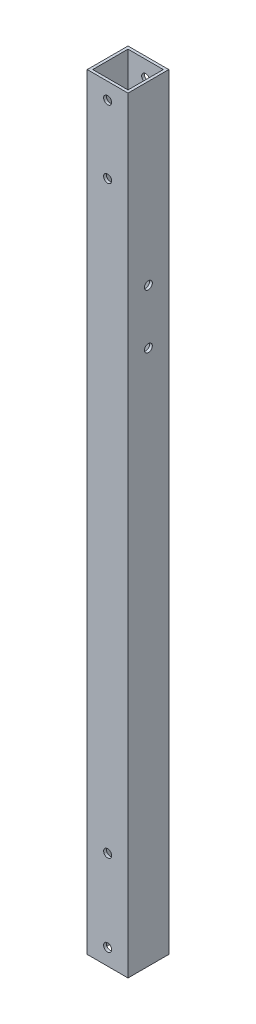
ISO-10303-21;
HEADER;
FILE_DESCRIPTION(('STEP AP214'),'2;1');
FILE_NAME('part.step','',(''),(''),'','','');
FILE_SCHEMA(('AUTOMOTIVE_DESIGN { 1 0 10303 214 1 1 1 1 }'));
ENDSEC;
DATA;
#1=APPLICATION_CONTEXT('core data for automotive mechanical design processes');
#2=APPLICATION_PROTOCOL_DEFINITION('international standard','automotive_design',2000,#1);
#3=PRODUCT_CONTEXT('',#1,'mechanical');
#4=PRODUCT('Part','Part','',(#3));
#5=PRODUCT_RELATED_PRODUCT_CATEGORY('part','',(#4));
#6=PRODUCT_DEFINITION_FORMATION('','',#4);
#7=PRODUCT_DEFINITION_CONTEXT('part definition',#1,'design');
#8=PRODUCT_DEFINITION('design','',#6,#7);
#9=PRODUCT_DEFINITION_SHAPE('','',#8);
#10=(LENGTH_UNIT() NAMED_UNIT(*) SI_UNIT(.MILLI.,.METRE.));
#11=(NAMED_UNIT(*) PLANE_ANGLE_UNIT() SI_UNIT($,.RADIAN.));
#12=(NAMED_UNIT(*) SI_UNIT($,.STERADIAN.) SOLID_ANGLE_UNIT());
#13=UNCERTAINTY_MEASURE_WITH_UNIT(LENGTH_MEASURE(1.E-05),#10,'distance_accuracy_value','');
#14=(GEOMETRIC_REPRESENTATION_CONTEXT(3) GLOBAL_UNCERTAINTY_ASSIGNED_CONTEXT((#13)) GLOBAL_UNIT_ASSIGNED_CONTEXT((#10,
#11,#12)) REPRESENTATION_CONTEXT('',''));
#15=CARTESIAN_POINT('',(0.,0.,0.));
#16=DIRECTION('',(0.,0.,1.));
#17=DIRECTION('',(1.,0.,0.));
#18=AXIS2_PLACEMENT_3D('',#15,#16,#17);
#19=CARTESIAN_POINT('',(0.,282.,0.));
#20=DIRECTION('',(0.,1.,0.));
#21=DIRECTION('',(0.,0.,1.));
#22=AXIS2_PLACEMENT_3D('',#19,#20,#21);
#23=PLANE('',#22);
#24=DIRECTION('',(0.,0.,-1.));
#25=VECTOR('',#24,1.);
#26=CARTESIAN_POINT('',(7.5,282.,7.5));
#27=LINE('',#26,#25);
#28=CARTESIAN_POINT('',(7.5,282.,7.5));
#29=VERTEX_POINT('',#28);
#30=CARTESIAN_POINT('',(7.5,282.,-7.5));
#31=VERTEX_POINT('',#30);
#32=EDGE_CURVE('E191',#29,#31,#27,.T.);
#33=ORIENTED_EDGE('',*,*,#32,.T.);
#34=DIRECTION('',(-1.,0.,0.));
#35=VECTOR('',#34,1.);
#36=CARTESIAN_POINT('',(-7.5,282.,-7.5));
#37=LINE('',#36,#35);
#38=CARTESIAN_POINT('',(-7.5,282.,-7.5));
#39=VERTEX_POINT('',#38);
#40=EDGE_CURVE('E195',#31,#39,#37,.T.);
#41=ORIENTED_EDGE('',*,*,#40,.T.);
#42=DIRECTION('',(0.,0.,1.));
#43=VECTOR('',#42,1.);
#44=CARTESIAN_POINT('',(-7.5,282.,7.5));
#45=LINE('',#44,#43);
#46=CARTESIAN_POINT('',(-7.5,282.,7.5));
#47=VERTEX_POINT('',#46);
#48=EDGE_CURVE('E199',#39,#47,#45,.T.);
#49=ORIENTED_EDGE('',*,*,#48,.T.);
#50=DIRECTION('',(1.,0.,0.));
#51=VECTOR('',#50,1.);
#52=CARTESIAN_POINT('',(-7.5,282.,7.5));
#53=LINE('',#52,#51);
#54=EDGE_CURVE('E202',#47,#29,#53,.T.);
#55=ORIENTED_EDGE('',*,*,#54,.T.);
#56=EDGE_LOOP('',(#33,#41,#49,#55));
#57=FACE_BOUND('',#56,.T.);
#58=DIRECTION('',(-1.,0.,0.));
#59=VECTOR('',#58,1.);
#60=CARTESIAN_POINT('',(0.,282.,-6.5));
#61=LINE('',#60,#59);
#62=CARTESIAN_POINT('',(6.5,282.,-6.5));
#63=VERTEX_POINT('',#62);
#64=CARTESIAN_POINT('',(-6.5,282.,-6.5));
#65=VERTEX_POINT('',#64);
#66=EDGE_CURVE('E149',#63,#65,#61,.T.);
#67=ORIENTED_EDGE('',*,*,#66,.F.);
#68=DIRECTION('',(0.,0.,-1.));
#69=VECTOR('',#68,1.);
#70=CARTESIAN_POINT('',(6.5,282.,0.));
#71=LINE('',#70,#69);
#72=CARTESIAN_POINT('',(6.5,282.,6.5));
#73=VERTEX_POINT('',#72);
#74=EDGE_CURVE('E140',#73,#63,#71,.T.);
#75=ORIENTED_EDGE('',*,*,#74,.F.);
#76=DIRECTION('',(1.,0.,0.));
#77=VECTOR('',#76,1.);
#78=CARTESIAN_POINT('',(0.,282.,6.5));
#79=LINE('',#78,#77);
#80=CARTESIAN_POINT('',(-6.5,282.,6.5));
#81=VERTEX_POINT('',#80);
#82=EDGE_CURVE('E169',#81,#73,#79,.T.);
#83=ORIENTED_EDGE('',*,*,#82,.F.);
#84=DIRECTION('',(0.,0.,1.));
#85=VECTOR('',#84,1.);
#86=CARTESIAN_POINT('',(-6.5,282.,0.));
#87=LINE('',#86,#85);
#88=EDGE_CURVE('E162',#65,#81,#87,.T.);
#89=ORIENTED_EDGE('',*,*,#88,.F.);
#90=EDGE_LOOP('',(#67,#75,#83,#89));
#91=FACE_BOUND('',#90,.T.);
#92=ADVANCED_FACE('F72',(#57,#91),#23,.T.);
#93=CARTESIAN_POINT('',(0.,0.,0.));
#94=DIRECTION('',(0.,1.,0.));
#95=DIRECTION('',(0.,0.,1.));
#96=AXIS2_PLACEMENT_3D('',#93,#94,#95);
#97=PLANE('',#96);
#98=DIRECTION('',(0.,0.,-1.));
#99=VECTOR('',#98,1.);
#100=CARTESIAN_POINT('',(7.5,0.,7.5));
#101=LINE('',#100,#99);
#102=CARTESIAN_POINT('',(7.5,0.,7.5));
#103=VERTEX_POINT('',#102);
#104=CARTESIAN_POINT('',(7.5,0.,-7.5));
#105=VERTEX_POINT('',#104);
#106=EDGE_CURVE('E158',#103,#105,#101,.T.);
#107=ORIENTED_EDGE('',*,*,#106,.F.);
#108=DIRECTION('',(1.,0.,0.));
#109=VECTOR('',#108,1.);
#110=CARTESIAN_POINT('',(-7.5,0.,7.5));
#111=LINE('',#110,#109);
#112=CARTESIAN_POINT('',(-7.5,0.,7.5));
#113=VERTEX_POINT('',#112);
#114=EDGE_CURVE('E196',#113,#103,#111,.T.);
#115=ORIENTED_EDGE('',*,*,#114,.F.);
#116=DIRECTION('',(0.,0.,1.));
#117=VECTOR('',#116,1.);
#118=CARTESIAN_POINT('',(-7.5,0.,7.5));
#119=LINE('',#118,#117);
#120=CARTESIAN_POINT('',(-7.5,0.,-7.5));
#121=VERTEX_POINT('',#120);
#122=EDGE_CURVE('E212',#121,#113,#119,.T.);
#123=ORIENTED_EDGE('',*,*,#122,.F.);
#124=DIRECTION('',(-1.,0.,0.));
#125=VECTOR('',#124,1.);
#126=CARTESIAN_POINT('',(-7.5,0.,-7.5));
#127=LINE('',#126,#125);
#128=EDGE_CURVE('E209',#105,#121,#127,.T.);
#129=ORIENTED_EDGE('',*,*,#128,.F.);
#130=EDGE_LOOP('',(#107,#115,#123,#129));
#131=FACE_BOUND('',#130,.T.);
#132=DIRECTION('',(0.,0.,-1.));
#133=VECTOR('',#132,1.);
#134=CARTESIAN_POINT('',(6.5,0.,0.));
#135=LINE('',#134,#133);
#136=CARTESIAN_POINT('',(6.5,0.,6.5));
#137=VERTEX_POINT('',#136);
#138=CARTESIAN_POINT('',(6.5,0.,-6.5));
#139=VERTEX_POINT('',#138);
#140=EDGE_CURVE('E98',#137,#139,#135,.T.);
#141=ORIENTED_EDGE('',*,*,#140,.T.);
#142=DIRECTION('',(-1.,0.,0.));
#143=VECTOR('',#142,1.);
#144=CARTESIAN_POINT('',(0.,0.,-6.5));
#145=LINE('',#144,#143);
#146=CARTESIAN_POINT('',(-6.5,0.,-6.5));
#147=VERTEX_POINT('',#146);
#148=EDGE_CURVE('E156',#139,#147,#145,.T.);
#149=ORIENTED_EDGE('',*,*,#148,.T.);
#150=DIRECTION('',(0.,0.,1.));
#151=VECTOR('',#150,1.);
#152=CARTESIAN_POINT('',(-6.5,0.,0.));
#153=LINE('',#152,#151);
#154=CARTESIAN_POINT('',(-6.5,0.,6.5));
#155=VERTEX_POINT('',#154);
#156=EDGE_CURVE('E178',#147,#155,#153,.T.);
#157=ORIENTED_EDGE('',*,*,#156,.T.);
#158=DIRECTION('',(1.,0.,0.));
#159=VECTOR('',#158,1.);
#160=CARTESIAN_POINT('',(0.,0.,6.5));
#161=LINE('',#160,#159);
#162=EDGE_CURVE('E150',#155,#137,#161,.T.);
#163=ORIENTED_EDGE('',*,*,#162,.T.);
#164=EDGE_LOOP('',(#141,#149,#157,#163));
#165=FACE_BOUND('',#164,.T.);
#166=ADVANCED_FACE('F360',(#131,#165),#97,.F.);
#167=CARTESIAN_POINT('',(7.5,282.,7.5));
#168=DIRECTION('',(-1.,0.,0.));
#169=DIRECTION('',(0.,0.,1.));
#170=AXIS2_PLACEMENT_3D('',#167,#168,#169);
#171=PLANE('',#170);
#172=CARTESIAN_POINT('',(7.5,217.,0.));
#173=DIRECTION('',(1.,0.,0.));
#174=DIRECTION('',(0.,0.,-1.));
#175=AXIS2_PLACEMENT_3D('',#172,#173,#174);
#176=CIRCLE('',#175,1.45);
#177=CARTESIAN_POINT('',(7.5,217.,-1.45));
#178=VERTEX_POINT('',#177);
#179=EDGE_CURVE('E259',#178,#178,#176,.T.);
#180=ORIENTED_EDGE('',*,*,#179,.F.);
#181=EDGE_LOOP('',(#180));
#182=FACE_BOUND('',#181,.T.);
#183=CARTESIAN_POINT('',(7.5,197.,0.));
#184=DIRECTION('',(1.,0.,0.));
#185=DIRECTION('',(0.,0.,-1.));
#186=AXIS2_PLACEMENT_3D('',#183,#184,#185);
#187=CIRCLE('',#186,1.45000000000001);
#188=CARTESIAN_POINT('',(7.5,197.,-1.45000000000001));
#189=VERTEX_POINT('',#188);
#190=EDGE_CURVE('E267',#189,#189,#187,.T.);
#191=ORIENTED_EDGE('',*,*,#190,.F.);
#192=EDGE_LOOP('',(#191));
#193=FACE_BOUND('',#192,.T.);
#194=ORIENTED_EDGE('',*,*,#106,.T.);
#195=DIRECTION('',(0.,-1.,0.));
#196=VECTOR('',#195,1.);
#197=CARTESIAN_POINT('',(7.5,282.,-7.5));
#198=LINE('',#197,#196);
#199=EDGE_CURVE('E12',#31,#105,#198,.T.);
#200=ORIENTED_EDGE('',*,*,#199,.F.);
#201=ORIENTED_EDGE('',*,*,#32,.F.);
#202=DIRECTION('',(0.,-1.,0.));
#203=VECTOR('',#202,1.);
#204=CARTESIAN_POINT('',(7.5,282.,7.5));
#205=LINE('',#204,#203);
#206=EDGE_CURVE('E205',#29,#103,#205,.T.);
#207=ORIENTED_EDGE('',*,*,#206,.T.);
#208=EDGE_LOOP('',(#194,#200,#201,#207));
#209=FACE_BOUND('',#208,.T.);
#210=ADVANCED_FACE('F74',(#182,#193,#209),#171,.F.);
#211=CARTESIAN_POINT('',(-7.5,282.,-7.5));
#212=DIRECTION('',(0.,0.,1.));
#213=DIRECTION('',(1.,0.,0.));
#214=AXIS2_PLACEMENT_3D('',#211,#212,#213);
#215=PLANE('',#214);
#216=CARTESIAN_POINT('',(0.,6.,-7.5));
#217=DIRECTION('',(0.,0.,1.));
#218=DIRECTION('',(1.,0.,0.));
#219=AXIS2_PLACEMENT_3D('',#216,#217,#218);
#220=CIRCLE('',#219,1.475);
#221=CARTESIAN_POINT('',(1.475,6.,-7.5));
#222=VERTEX_POINT('',#221);
#223=EDGE_CURVE('E294',#222,#222,#220,.T.);
#224=ORIENTED_EDGE('',*,*,#223,.T.);
#225=EDGE_LOOP('',(#224));
#226=FACE_BOUND('',#225,.T.);
#227=CARTESIAN_POINT('',(0.,276.,-7.5));
#228=DIRECTION('',(0.,0.,1.));
#229=DIRECTION('',(1.,0.,0.));
#230=AXIS2_PLACEMENT_3D('',#227,#228,#229);
#231=CIRCLE('',#230,1.47500000000002);
#232=CARTESIAN_POINT('',(1.47500000000002,276.,-7.5));
#233=VERTEX_POINT('',#232);
#234=EDGE_CURVE('E285',#233,#233,#231,.T.);
#235=ORIENTED_EDGE('',*,*,#234,.T.);
#236=EDGE_LOOP('',(#235));
#237=FACE_BOUND('',#236,.T.);
#238=CARTESIAN_POINT('',(0.,251.,-7.5));
#239=DIRECTION('',(0.,0.,1.));
#240=DIRECTION('',(1.,0.,0.));
#241=AXIS2_PLACEMENT_3D('',#238,#239,#240);
#242=CIRCLE('',#241,1.47500000000001);
#243=CARTESIAN_POINT('',(1.47500000000001,251.,-7.5));
#244=VERTEX_POINT('',#243);
#245=EDGE_CURVE('E280',#244,#244,#242,.T.);
#246=ORIENTED_EDGE('',*,*,#245,.T.);
#247=EDGE_LOOP('',(#246));
#248=FACE_BOUND('',#247,.T.);
#249=CARTESIAN_POINT('',(0.,36.,-7.5));
#250=DIRECTION('',(0.,0.,1.));
#251=DIRECTION('',(1.,0.,0.));
#252=AXIS2_PLACEMENT_3D('',#249,#250,#251);
#253=CIRCLE('',#252,1.475);
#254=CARTESIAN_POINT('',(1.475,36.,-7.5));
#255=VERTEX_POINT('',#254);
#256=EDGE_CURVE('E232',#255,#255,#253,.T.);
#257=ORIENTED_EDGE('',*,*,#256,.T.);
#258=EDGE_LOOP('',(#257));
#259=FACE_BOUND('',#258,.T.);
#260=ORIENTED_EDGE('',*,*,#128,.T.);
#261=DIRECTION('',(0.,-1.,0.));
#262=VECTOR('',#261,1.);
#263=CARTESIAN_POINT('',(-7.5,282.,-7.5));
#264=LINE('',#263,#262);
#265=EDGE_CURVE('E82',#39,#121,#264,.T.);
#266=ORIENTED_EDGE('',*,*,#265,.F.);
#267=ORIENTED_EDGE('',*,*,#40,.F.);
#268=ORIENTED_EDGE('',*,*,#199,.T.);
#269=EDGE_LOOP('',(#260,#266,#267,#268));
#270=FACE_BOUND('',#269,.T.);
#271=ADVANCED_FACE('F346',(#226,#237,#248,#259,#270),#215,.F.);
#272=CARTESIAN_POINT('',(-7.5,282.,7.5));
#273=DIRECTION('',(1.,0.,0.));
#274=DIRECTION('',(0.,0.,-1.));
#275=AXIS2_PLACEMENT_3D('',#272,#273,#274);
#276=PLANE('',#275);
#277=CARTESIAN_POINT('',(-7.5,217.,0.));
#278=DIRECTION('',(1.,0.,0.));
#279=DIRECTION('',(0.,0.,-1.));
#280=AXIS2_PLACEMENT_3D('',#277,#278,#279);
#281=CIRCLE('',#280,1.45);
#282=CARTESIAN_POINT('',(-7.5,217.,-1.45));
#283=VERTEX_POINT('',#282);
#284=EDGE_CURVE('E250',#283,#283,#281,.T.);
#285=ORIENTED_EDGE('',*,*,#284,.T.);
#286=EDGE_LOOP('',(#285));
#287=FACE_BOUND('',#286,.T.);
#288=CARTESIAN_POINT('',(-7.5,197.,0.));
#289=DIRECTION('',(1.,0.,0.));
#290=DIRECTION('',(0.,0.,-1.));
#291=AXIS2_PLACEMENT_3D('',#288,#289,#290);
#292=CIRCLE('',#291,1.45000000000001);
#293=CARTESIAN_POINT('',(-7.5,197.,-1.45000000000001));
#294=VERTEX_POINT('',#293);
#295=EDGE_CURVE('E273',#294,#294,#292,.T.);
#296=ORIENTED_EDGE('',*,*,#295,.T.);
#297=EDGE_LOOP('',(#296));
#298=FACE_BOUND('',#297,.T.);
#299=ORIENTED_EDGE('',*,*,#122,.T.);
#300=DIRECTION('',(0.,-1.,0.));
#301=VECTOR('',#300,1.);
#302=CARTESIAN_POINT('',(-7.5,282.,7.5));
#303=LINE('',#302,#301);
#304=EDGE_CURVE('E220',#47,#113,#303,.T.);
#305=ORIENTED_EDGE('',*,*,#304,.F.);
#306=ORIENTED_EDGE('',*,*,#48,.F.);
#307=ORIENTED_EDGE('',*,*,#265,.T.);
#308=EDGE_LOOP('',(#299,#305,#306,#307));
#309=FACE_BOUND('',#308,.T.);
#310=ADVANCED_FACE('F349',(#287,#298,#309),#276,.F.);
#311=CARTESIAN_POINT('',(-7.5,282.,7.5));
#312=DIRECTION('',(0.,0.,-1.));
#313=DIRECTION('',(-1.,0.,0.));
#314=AXIS2_PLACEMENT_3D('',#311,#312,#313);
#315=PLANE('',#314);
#316=CARTESIAN_POINT('',(0.,6.,7.5));
#317=DIRECTION('',(0.,0.,1.));
#318=DIRECTION('',(1.,0.,0.));
#319=AXIS2_PLACEMENT_3D('',#316,#317,#318);
#320=CIRCLE('',#319,1.475);
#321=CARTESIAN_POINT('',(1.475,6.,7.5));
#322=VERTEX_POINT('',#321);
#323=EDGE_CURVE('E289',#322,#322,#320,.T.);
#324=ORIENTED_EDGE('',*,*,#323,.F.);
#325=EDGE_LOOP('',(#324));
#326=FACE_BOUND('',#325,.T.);
#327=CARTESIAN_POINT('',(0.,276.,7.5));
#328=DIRECTION('',(0.,0.,1.));
#329=DIRECTION('',(1.,0.,0.));
#330=AXIS2_PLACEMENT_3D('',#327,#328,#329);
#331=CIRCLE('',#330,1.47500000000002);
#332=CARTESIAN_POINT('',(1.47500000000002,276.,7.5));
#333=VERTEX_POINT('',#332);
#334=EDGE_CURVE('E298',#333,#333,#331,.T.);
#335=ORIENTED_EDGE('',*,*,#334,.F.);
#336=EDGE_LOOP('',(#335));
#337=FACE_BOUND('',#336,.T.);
#338=CARTESIAN_POINT('',(0.,251.,7.5));
#339=DIRECTION('',(0.,0.,1.));
#340=DIRECTION('',(1.,0.,0.));
#341=AXIS2_PLACEMENT_3D('',#338,#339,#340);
#342=CIRCLE('',#341,1.47500000000001);
#343=CARTESIAN_POINT('',(1.47500000000001,251.,7.5));
#344=VERTEX_POINT('',#343);
#345=EDGE_CURVE('E281',#344,#344,#342,.T.);
#346=ORIENTED_EDGE('',*,*,#345,.F.);
#347=EDGE_LOOP('',(#346));
#348=FACE_BOUND('',#347,.T.);
#349=CARTESIAN_POINT('',(0.,36.,7.5));
#350=DIRECTION('',(0.,0.,1.));
#351=DIRECTION('',(1.,0.,0.));
#352=AXIS2_PLACEMENT_3D('',#349,#350,#351);
#353=CIRCLE('',#352,1.475);
#354=CARTESIAN_POINT('',(1.475,36.,7.5));
#355=VERTEX_POINT('',#354);
#356=EDGE_CURVE('E293',#355,#355,#353,.T.);
#357=ORIENTED_EDGE('',*,*,#356,.F.);
#358=EDGE_LOOP('',(#357));
#359=FACE_BOUND('',#358,.T.);
#360=ORIENTED_EDGE('',*,*,#114,.T.);
#361=ORIENTED_EDGE('',*,*,#206,.F.);
#362=ORIENTED_EDGE('',*,*,#54,.F.);
#363=ORIENTED_EDGE('',*,*,#304,.T.);
#364=EDGE_LOOP('',(#360,#361,#362,#363));
#365=FACE_BOUND('',#364,.T.);
#366=ADVANCED_FACE('F364',(#326,#337,#348,#359,#365),#315,.F.);
#367=CARTESIAN_POINT('',(6.5,282.,0.));
#368=DIRECTION('',(-1.,0.,0.));
#369=DIRECTION('',(0.,0.,1.));
#370=AXIS2_PLACEMENT_3D('',#367,#368,#369);
#371=PLANE('',#370);
#372=CARTESIAN_POINT('',(6.5,217.,0.));
#373=DIRECTION('',(-1.,0.,0.));
#374=DIRECTION('',(0.,0.,1.));
#375=AXIS2_PLACEMENT_3D('',#372,#373,#374);
#376=CIRCLE('',#375,1.45);
#377=CARTESIAN_POINT('',(6.5,217.,1.45));
#378=VERTEX_POINT('',#377);
#379=EDGE_CURVE('E277',#378,#378,#376,.T.);
#380=ORIENTED_EDGE('',*,*,#379,.F.);
#381=EDGE_LOOP('',(#380));
#382=FACE_BOUND('',#381,.T.);
#383=CARTESIAN_POINT('',(6.5,197.,0.));
#384=DIRECTION('',(-1.,0.,0.));
#385=DIRECTION('',(0.,0.,1.));
#386=AXIS2_PLACEMENT_3D('',#383,#384,#385);
#387=CIRCLE('',#386,1.45000000000001);
#388=CARTESIAN_POINT('',(6.5,197.,1.45000000000001));
#389=VERTEX_POINT('',#388);
#390=EDGE_CURVE('E249',#389,#389,#387,.T.);
#391=ORIENTED_EDGE('',*,*,#390,.F.);
#392=EDGE_LOOP('',(#391));
#393=FACE_BOUND('',#392,.T.);
#394=ORIENTED_EDGE('',*,*,#140,.F.);
#395=DIRECTION('',(0.,-1.,0.));
#396=VECTOR('',#395,1.);
#397=CARTESIAN_POINT('',(6.5,282.,6.5));
#398=LINE('',#397,#396);
#399=EDGE_CURVE('E144',#73,#137,#398,.T.);
#400=ORIENTED_EDGE('',*,*,#399,.F.);
#401=ORIENTED_EDGE('',*,*,#74,.T.);
#402=DIRECTION('',(0.,-1.,0.));
#403=VECTOR('',#402,1.);
#404=CARTESIAN_POINT('',(6.5,282.,-6.5));
#405=LINE('',#404,#403);
#406=EDGE_CURVE('E143',#63,#139,#405,.T.);
#407=ORIENTED_EDGE('',*,*,#406,.T.);
#408=EDGE_LOOP('',(#394,#400,#401,#407));
#409=FACE_BOUND('',#408,.T.);
#410=ADVANCED_FACE('F142',(#382,#393,#409),#371,.T.);
#411=CARTESIAN_POINT('',(0.,282.,-6.5));
#412=DIRECTION('',(0.,0.,1.));
#413=DIRECTION('',(1.,0.,0.));
#414=AXIS2_PLACEMENT_3D('',#411,#412,#413);
#415=PLANE('',#414);
#416=CARTESIAN_POINT('',(0.,6.,-6.5));
#417=DIRECTION('',(0.,0.,1.));
#418=DIRECTION('',(1.,0.,0.));
#419=AXIS2_PLACEMENT_3D('',#416,#417,#418);
#420=CIRCLE('',#419,1.475);
#421=CARTESIAN_POINT('',(1.475,6.,-6.5));
#422=VERTEX_POINT('',#421);
#423=EDGE_CURVE('E176',#422,#422,#420,.T.);
#424=ORIENTED_EDGE('',*,*,#423,.F.);
#425=EDGE_LOOP('',(#424));
#426=FACE_BOUND('',#425,.T.);
#427=CARTESIAN_POINT('',(0.,276.,-6.5));
#428=DIRECTION('',(0.,0.,1.));
#429=DIRECTION('',(1.,0.,0.));
#430=AXIS2_PLACEMENT_3D('',#427,#428,#429);
#431=CIRCLE('',#430,1.47500000000002);
#432=CARTESIAN_POINT('',(1.47500000000002,276.,-6.5));
#433=VERTEX_POINT('',#432);
#434=EDGE_CURVE('E242',#433,#433,#431,.T.);
#435=ORIENTED_EDGE('',*,*,#434,.F.);
#436=EDGE_LOOP('',(#435));
#437=FACE_BOUND('',#436,.T.);
#438=CARTESIAN_POINT('',(0.,251.,-6.5));
#439=DIRECTION('',(0.,0.,1.));
#440=DIRECTION('',(1.,0.,0.));
#441=AXIS2_PLACEMENT_3D('',#438,#439,#440);
#442=CIRCLE('',#441,1.47500000000001);
#443=CARTESIAN_POINT('',(1.47500000000001,251.,-6.5));
#444=VERTEX_POINT('',#443);
#445=EDGE_CURVE('E237',#444,#444,#442,.T.);
#446=ORIENTED_EDGE('',*,*,#445,.F.);
#447=EDGE_LOOP('',(#446));
#448=FACE_BOUND('',#447,.T.);
#449=CARTESIAN_POINT('',(0.,36.,-6.5));
#450=DIRECTION('',(0.,0.,1.));
#451=DIRECTION('',(1.,0.,0.));
#452=AXIS2_PLACEMENT_3D('',#449,#450,#451);
#453=CIRCLE('',#452,1.475);
#454=CARTESIAN_POINT('',(1.475,36.,-6.5));
#455=VERTEX_POINT('',#454);
#456=EDGE_CURVE('E231',#455,#455,#453,.T.);
#457=ORIENTED_EDGE('',*,*,#456,.F.);
#458=EDGE_LOOP('',(#457));
#459=FACE_BOUND('',#458,.T.);
#460=ORIENTED_EDGE('',*,*,#148,.F.);
#461=ORIENTED_EDGE('',*,*,#406,.F.);
#462=ORIENTED_EDGE('',*,*,#66,.T.);
#463=DIRECTION('',(0.,-1.,0.));
#464=VECTOR('',#463,1.);
#465=CARTESIAN_POINT('',(-6.5,282.,-6.5));
#466=LINE('',#465,#464);
#467=EDGE_CURVE('E159',#65,#147,#466,.T.);
#468=ORIENTED_EDGE('',*,*,#467,.T.);
#469=EDGE_LOOP('',(#460,#461,#462,#468));
#470=FACE_BOUND('',#469,.T.);
#471=ADVANCED_FACE('F153',(#426,#437,#448,#459,#470),#415,.T.);
#472=CARTESIAN_POINT('',(-6.5,282.,0.));
#473=DIRECTION('',(1.,0.,0.));
#474=DIRECTION('',(0.,0.,-1.));
#475=AXIS2_PLACEMENT_3D('',#472,#473,#474);
#476=PLANE('',#475);
#477=CARTESIAN_POINT('',(-6.5,217.,0.));
#478=DIRECTION('',(1.,0.,0.));
#479=DIRECTION('',(0.,0.,-1.));
#480=AXIS2_PLACEMENT_3D('',#477,#478,#479);
#481=CIRCLE('',#480,1.45);
#482=CARTESIAN_POINT('',(-6.5,217.,-1.45));
#483=VERTEX_POINT('',#482);
#484=EDGE_CURVE('E76',#483,#483,#481,.T.);
#485=ORIENTED_EDGE('',*,*,#484,.F.);
#486=EDGE_LOOP('',(#485));
#487=FACE_BOUND('',#486,.T.);
#488=CARTESIAN_POINT('',(-6.5,197.,0.));
#489=DIRECTION('',(1.,0.,0.));
#490=DIRECTION('',(0.,0.,-1.));
#491=AXIS2_PLACEMENT_3D('',#488,#489,#490);
#492=CIRCLE('',#491,1.45000000000001);
#493=CARTESIAN_POINT('',(-6.5,197.,-1.45000000000001));
#494=VERTEX_POINT('',#493);
#495=EDGE_CURVE('E246',#494,#494,#492,.T.);
#496=ORIENTED_EDGE('',*,*,#495,.F.);
#497=EDGE_LOOP('',(#496));
#498=FACE_BOUND('',#497,.T.);
#499=ORIENTED_EDGE('',*,*,#156,.F.);
#500=ORIENTED_EDGE('',*,*,#467,.F.);
#501=ORIENTED_EDGE('',*,*,#88,.T.);
#502=DIRECTION('',(0.,-1.,0.));
#503=VECTOR('',#502,1.);
#504=CARTESIAN_POINT('',(-6.5,282.,6.5));
#505=LINE('',#504,#503);
#506=EDGE_CURVE('E90',#81,#155,#505,.T.);
#507=ORIENTED_EDGE('',*,*,#506,.T.);
#508=EDGE_LOOP('',(#499,#500,#501,#507));
#509=FACE_BOUND('',#508,.T.);
#510=ADVANCED_FACE('F329',(#487,#498,#509),#476,.T.);
#511=CARTESIAN_POINT('',(0.,282.,6.5));
#512=DIRECTION('',(0.,0.,-1.));
#513=DIRECTION('',(-1.,0.,0.));
#514=AXIS2_PLACEMENT_3D('',#511,#512,#513);
#515=PLANE('',#514);
#516=CARTESIAN_POINT('',(0.,6.,6.5));
#517=DIRECTION('',(0.,0.,-1.));
#518=DIRECTION('',(-1.,0.,0.));
#519=AXIS2_PLACEMENT_3D('',#516,#517,#518);
#520=CIRCLE('',#519,1.475);
#521=CARTESIAN_POINT('',(-1.475,6.,6.5));
#522=VERTEX_POINT('',#521);
#523=EDGE_CURVE('E243',#522,#522,#520,.T.);
#524=ORIENTED_EDGE('',*,*,#523,.F.);
#525=EDGE_LOOP('',(#524));
#526=FACE_BOUND('',#525,.T.);
#527=CARTESIAN_POINT('',(0.,276.,6.5));
#528=DIRECTION('',(0.,0.,-1.));
#529=DIRECTION('',(-1.,0.,0.));
#530=AXIS2_PLACEMENT_3D('',#527,#528,#529);
#531=CIRCLE('',#530,1.47500000000002);
#532=CARTESIAN_POINT('',(-1.47500000000002,276.,6.5));
#533=VERTEX_POINT('',#532);
#534=EDGE_CURVE('E238',#533,#533,#531,.T.);
#535=ORIENTED_EDGE('',*,*,#534,.F.);
#536=EDGE_LOOP('',(#535));
#537=FACE_BOUND('',#536,.T.);
#538=CARTESIAN_POINT('',(0.,251.,6.5));
#539=DIRECTION('',(0.,0.,-1.));
#540=DIRECTION('',(-1.,0.,0.));
#541=AXIS2_PLACEMENT_3D('',#538,#539,#540);
#542=CIRCLE('',#541,1.47500000000001);
#543=CARTESIAN_POINT('',(-1.47500000000001,251.,6.5));
#544=VERTEX_POINT('',#543);
#545=EDGE_CURVE('E233',#544,#544,#542,.T.);
#546=ORIENTED_EDGE('',*,*,#545,.F.);
#547=EDGE_LOOP('',(#546));
#548=FACE_BOUND('',#547,.T.);
#549=CARTESIAN_POINT('',(0.,36.,6.5));
#550=DIRECTION('',(0.,0.,-1.));
#551=DIRECTION('',(-1.,0.,0.));
#552=AXIS2_PLACEMENT_3D('',#549,#550,#551);
#553=CIRCLE('',#552,1.475);
#554=CARTESIAN_POINT('',(-1.475,36.,6.5));
#555=VERTEX_POINT('',#554);
#556=EDGE_CURVE('E227',#555,#555,#553,.T.);
#557=ORIENTED_EDGE('',*,*,#556,.F.);
#558=EDGE_LOOP('',(#557));
#559=FACE_BOUND('',#558,.T.);
#560=ORIENTED_EDGE('',*,*,#162,.F.);
#561=ORIENTED_EDGE('',*,*,#506,.F.);
#562=ORIENTED_EDGE('',*,*,#82,.T.);
#563=ORIENTED_EDGE('',*,*,#399,.T.);
#564=EDGE_LOOP('',(#560,#561,#562,#563));
#565=FACE_BOUND('',#564,.T.);
#566=ADVANCED_FACE('F442',(#526,#537,#548,#559,#565),#515,.T.);
#567=CARTESIAN_POINT('',(0.,36.,-7.5));
#568=DIRECTION('',(0.,0.,1.));
#569=DIRECTION('',(1.,0.,0.));
#570=AXIS2_PLACEMENT_3D('',#567,#568,#569);
#571=CYLINDRICAL_SURFACE('',#570,1.475);
#572=ORIENTED_EDGE('',*,*,#556,.T.);
#573=EDGE_LOOP('',(#572));
#574=FACE_BOUND('',#573,.T.);
#575=ORIENTED_EDGE('',*,*,#356,.T.);
#576=EDGE_LOOP('',(#575));
#577=FACE_BOUND('',#576,.T.);
#578=ADVANCED_FACE('F343',(#574,#577),#571,.F.);
#579=CARTESIAN_POINT('',(0.,251.,-7.5));
#580=DIRECTION('',(0.,0.,1.));
#581=DIRECTION('',(1.,0.,0.));
#582=AXIS2_PLACEMENT_3D('',#579,#580,#581);
#583=CYLINDRICAL_SURFACE('',#582,1.47500000000001);
#584=ORIENTED_EDGE('',*,*,#545,.T.);
#585=EDGE_LOOP('',(#584));
#586=FACE_BOUND('',#585,.T.);
#587=ORIENTED_EDGE('',*,*,#345,.T.);
#588=EDGE_LOOP('',(#587));
#589=FACE_BOUND('',#588,.T.);
#590=ADVANCED_FACE('F456',(#586,#589),#583,.F.);
#591=CARTESIAN_POINT('',(0.,276.,-7.5));
#592=DIRECTION('',(0.,0.,1.));
#593=DIRECTION('',(1.,0.,0.));
#594=AXIS2_PLACEMENT_3D('',#591,#592,#593);
#595=CYLINDRICAL_SURFACE('',#594,1.47500000000002);
#596=ORIENTED_EDGE('',*,*,#534,.T.);
#597=EDGE_LOOP('',(#596));
#598=FACE_BOUND('',#597,.T.);
#599=ORIENTED_EDGE('',*,*,#334,.T.);
#600=EDGE_LOOP('',(#599));
#601=FACE_BOUND('',#600,.T.);
#602=ADVANCED_FACE('F465',(#598,#601),#595,.F.);
#603=CARTESIAN_POINT('',(0.,6.,-7.5));
#604=DIRECTION('',(0.,0.,1.));
#605=DIRECTION('',(1.,0.,0.));
#606=AXIS2_PLACEMENT_3D('',#603,#604,#605);
#607=CYLINDRICAL_SURFACE('',#606,1.475);
#608=ORIENTED_EDGE('',*,*,#523,.T.);
#609=EDGE_LOOP('',(#608));
#610=FACE_BOUND('',#609,.T.);
#611=ORIENTED_EDGE('',*,*,#323,.T.);
#612=EDGE_LOOP('',(#611));
#613=FACE_BOUND('',#612,.T.);
#614=ADVANCED_FACE('F341',(#610,#613),#607,.F.);
#615=ORIENTED_EDGE('',*,*,#456,.T.);
#616=EDGE_LOOP('',(#615));
#617=FACE_BOUND('',#616,.T.);
#618=ORIENTED_EDGE('',*,*,#256,.F.);
#619=EDGE_LOOP('',(#618));
#620=FACE_BOUND('',#619,.T.);
#621=ADVANCED_FACE('F337',(#617,#620),#571,.F.);
#622=ORIENTED_EDGE('',*,*,#445,.T.);
#623=EDGE_LOOP('',(#622));
#624=FACE_BOUND('',#623,.T.);
#625=ORIENTED_EDGE('',*,*,#245,.F.);
#626=EDGE_LOOP('',(#625));
#627=FACE_BOUND('',#626,.T.);
#628=ADVANCED_FACE('F340',(#624,#627),#583,.F.);
#629=ORIENTED_EDGE('',*,*,#434,.T.);
#630=EDGE_LOOP('',(#629));
#631=FACE_BOUND('',#630,.T.);
#632=ORIENTED_EDGE('',*,*,#234,.F.);
#633=EDGE_LOOP('',(#632));
#634=FACE_BOUND('',#633,.T.);
#635=ADVANCED_FACE('F395',(#631,#634),#595,.F.);
#636=ORIENTED_EDGE('',*,*,#423,.T.);
#637=EDGE_LOOP('',(#636));
#638=FACE_BOUND('',#637,.T.);
#639=ORIENTED_EDGE('',*,*,#223,.F.);
#640=EDGE_LOOP('',(#639));
#641=FACE_BOUND('',#640,.T.);
#642=ADVANCED_FACE('F324',(#638,#641),#607,.F.);
#643=CARTESIAN_POINT('',(-7.5,197.,0.));
#644=DIRECTION('',(1.,0.,0.));
#645=DIRECTION('',(0.,0.,-1.));
#646=AXIS2_PLACEMENT_3D('',#643,#644,#645);
#647=CYLINDRICAL_SURFACE('',#646,1.45000000000001);
#648=ORIENTED_EDGE('',*,*,#495,.T.);
#649=EDGE_LOOP('',(#648));
#650=FACE_BOUND('',#649,.T.);
#651=ORIENTED_EDGE('',*,*,#295,.F.);
#652=EDGE_LOOP('',(#651));
#653=FACE_BOUND('',#652,.T.);
#654=ADVANCED_FACE('F384',(#650,#653),#647,.F.);
#655=CARTESIAN_POINT('',(-7.5,217.,0.));
#656=DIRECTION('',(1.,0.,0.));
#657=DIRECTION('',(0.,0.,-1.));
#658=AXIS2_PLACEMENT_3D('',#655,#656,#657);
#659=CYLINDRICAL_SURFACE('',#658,1.45);
#660=ORIENTED_EDGE('',*,*,#484,.T.);
#661=EDGE_LOOP('',(#660));
#662=FACE_BOUND('',#661,.T.);
#663=ORIENTED_EDGE('',*,*,#284,.F.);
#664=EDGE_LOOP('',(#663));
#665=FACE_BOUND('',#664,.T.);
#666=ADVANCED_FACE('F386',(#662,#665),#659,.F.);
#667=ORIENTED_EDGE('',*,*,#390,.T.);
#668=EDGE_LOOP('',(#667));
#669=FACE_BOUND('',#668,.T.);
#670=ORIENTED_EDGE('',*,*,#190,.T.);
#671=EDGE_LOOP('',(#670));
#672=FACE_BOUND('',#671,.T.);
#673=ADVANCED_FACE('F388',(#669,#672),#647,.F.);
#674=ORIENTED_EDGE('',*,*,#379,.T.);
#675=EDGE_LOOP('',(#674));
#676=FACE_BOUND('',#675,.T.);
#677=ORIENTED_EDGE('',*,*,#179,.T.);
#678=EDGE_LOOP('',(#677));
#679=FACE_BOUND('',#678,.T.);
#680=ADVANCED_FACE('F394',(#676,#679),#659,.F.);
#681=CLOSED_SHELL('',(#92,#166,#210,#271,#310,#366,#410,#471,#510,#566,#578,#590,#602,#614,#621,
#628,#635,#642,#654,#666,#673,#680));
#682=MANIFOLD_SOLID_BREP('B2',#681);
#683=ADVANCED_BREP_SHAPE_REPRESENTATION('',(#18,#682),#14);
#684=SHAPE_DEFINITION_REPRESENTATION(#9,#683);
ENDSEC;
END-ISO-10303-21;
